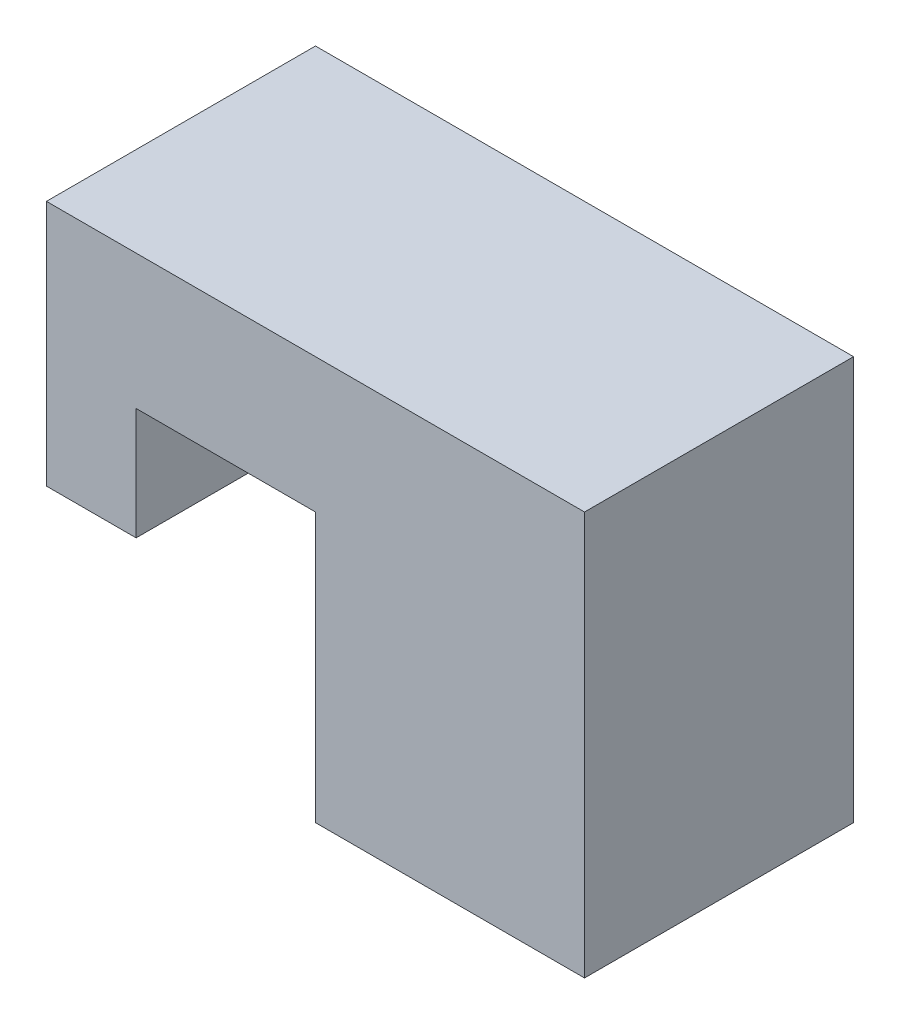
ISO-10303-21;
HEADER;
FILE_DESCRIPTION(('STEP AP214'),'2;1');
FILE_NAME('part.step','',(''),(''),'','','');
FILE_SCHEMA(('AUTOMOTIVE_DESIGN { 1 0 10303 214 1 1 1 1 }'));
ENDSEC;
DATA;
#1=APPLICATION_CONTEXT('core data for automotive mechanical design processes');
#2=APPLICATION_PROTOCOL_DEFINITION('international standard','automotive_design',2000,#1);
#3=PRODUCT_CONTEXT('',#1,'mechanical');
#4=PRODUCT('Part','Part','',(#3));
#5=PRODUCT_RELATED_PRODUCT_CATEGORY('part','',(#4));
#6=PRODUCT_DEFINITION_FORMATION('','',#4);
#7=PRODUCT_DEFINITION_CONTEXT('part definition',#1,'design');
#8=PRODUCT_DEFINITION('design','',#6,#7);
#9=PRODUCT_DEFINITION_SHAPE('','',#8);
#10=(LENGTH_UNIT() NAMED_UNIT(*) SI_UNIT(.MILLI.,.METRE.));
#11=(NAMED_UNIT(*) PLANE_ANGLE_UNIT() SI_UNIT($,.RADIAN.));
#12=(NAMED_UNIT(*) SI_UNIT($,.STERADIAN.) SOLID_ANGLE_UNIT());
#13=UNCERTAINTY_MEASURE_WITH_UNIT(LENGTH_MEASURE(1.E-05),#10,'distance_accuracy_value','');
#14=(GEOMETRIC_REPRESENTATION_CONTEXT(3) GLOBAL_UNCERTAINTY_ASSIGNED_CONTEXT((#13)) GLOBAL_UNIT_ASSIGNED_CONTEXT((#10,
#11,#12)) REPRESENTATION_CONTEXT('',''));
#15=CARTESIAN_POINT('',(0.,0.,0.));
#16=DIRECTION('',(0.,0.,1.));
#17=DIRECTION('',(1.,0.,0.));
#18=AXIS2_PLACEMENT_3D('',#15,#16,#17);
#19=CARTESIAN_POINT('',(0.,6.,0.));
#20=DIRECTION('',(0.,1.,0.));
#21=DIRECTION('',(0.,0.,1.));
#22=AXIS2_PLACEMENT_3D('',#19,#20,#21);
#23=PLANE('',#22);
#24=DIRECTION('',(0.,0.,1.));
#25=VECTOR('',#24,1.);
#26=CARTESIAN_POINT('',(-7.,6.,3.));
#27=LINE('',#26,#25);
#28=CARTESIAN_POINT('',(-7.,6.,-3.));
#29=VERTEX_POINT('',#28);
#30=CARTESIAN_POINT('',(-7.,6.,3.));
#31=VERTEX_POINT('',#30);
#32=EDGE_CURVE('E190',#29,#31,#27,.T.);
#33=ORIENTED_EDGE('',*,*,#32,.F.);
#34=DIRECTION('',(-1.,0.,0.));
#35=VECTOR('',#34,1.);
#36=CARTESIAN_POINT('',(3.,6.,-3.));
#37=LINE('',#36,#35);
#38=CARTESIAN_POINT('',(-3.,6.,-3.));
#39=VERTEX_POINT('',#38);
#40=EDGE_CURVE('E137',#39,#29,#37,.T.);
#41=ORIENTED_EDGE('',*,*,#40,.F.);
#42=DIRECTION('',(0.,0.,1.));
#43=VECTOR('',#42,1.);
#44=CARTESIAN_POINT('',(-3.,6.,3.));
#45=LINE('',#44,#43);
#46=CARTESIAN_POINT('',(-3.,6.,3.));
#47=VERTEX_POINT('',#46);
#48=EDGE_CURVE('E98',#39,#47,#45,.T.);
#49=ORIENTED_EDGE('',*,*,#48,.T.);
#50=DIRECTION('',(1.,0.,0.));
#51=VECTOR('',#50,1.);
#52=CARTESIAN_POINT('',(3.,6.,3.));
#53=LINE('',#52,#51);
#54=EDGE_CURVE('E89',#31,#47,#53,.T.);
#55=ORIENTED_EDGE('',*,*,#54,.F.);
#56=EDGE_LOOP('',(#33,#41,#49,#55));
#57=FACE_BOUND('',#56,.T.);
#58=ADVANCED_FACE('F39',(#57),#23,.F.);
#59=CARTESIAN_POINT('',(3.,6.,3.));
#60=DIRECTION('',(-1.,0.,0.));
#61=DIRECTION('',(0.,0.,1.));
#62=AXIS2_PLACEMENT_3D('',#59,#60,#61);
#63=PLANE('',#62);
#64=DIRECTION('',(0.,0.,-1.));
#65=VECTOR('',#64,1.);
#66=CARTESIAN_POINT('',(3.,0.,3.));
#67=LINE('',#66,#65);
#68=CARTESIAN_POINT('',(3.,0.,3.));
#69=VERTEX_POINT('',#68);
#70=CARTESIAN_POINT('',(3.,0.,-3.));
#71=VERTEX_POINT('',#70);
#72=EDGE_CURVE('E96',#69,#71,#67,.T.);
#73=ORIENTED_EDGE('',*,*,#72,.T.);
#74=DIRECTION('',(0.,-1.,0.));
#75=VECTOR('',#74,1.);
#76=CARTESIAN_POINT('',(3.,6.,-3.));
#77=LINE('',#76,#75);
#78=CARTESIAN_POINT('',(3.,9.,-3.));
#79=VERTEX_POINT('',#78);
#80=EDGE_CURVE('E11',#79,#71,#77,.T.);
#81=ORIENTED_EDGE('',*,*,#80,.F.);
#82=DIRECTION('',(0.,0.,-1.));
#83=VECTOR('',#82,1.);
#84=CARTESIAN_POINT('',(3.,9.,-3.));
#85=LINE('',#84,#83);
#86=CARTESIAN_POINT('',(3.,9.,3.));
#87=VERTEX_POINT('',#86);
#88=EDGE_CURVE('E111',#87,#79,#85,.T.);
#89=ORIENTED_EDGE('',*,*,#88,.F.);
#90=DIRECTION('',(0.,-1.,0.));
#91=VECTOR('',#90,1.);
#92=CARTESIAN_POINT('',(3.,6.,3.));
#93=LINE('',#92,#91);
#94=EDGE_CURVE('E91',#87,#69,#93,.T.);
#95=ORIENTED_EDGE('',*,*,#94,.T.);
#96=EDGE_LOOP('',(#73,#81,#89,#95));
#97=FACE_BOUND('',#96,.T.);
#98=ADVANCED_FACE('F41',(#97),#63,.F.);
#99=CARTESIAN_POINT('',(-3.,6.,-3.));
#100=DIRECTION('',(0.,0.,1.));
#101=DIRECTION('',(1.,0.,0.));
#102=AXIS2_PLACEMENT_3D('',#99,#100,#101);
#103=PLANE('',#102);
#104=DIRECTION('',(-1.,0.,0.));
#105=VECTOR('',#104,1.);
#106=CARTESIAN_POINT('',(-3.,0.,-3.));
#107=LINE('',#106,#105);
#108=CARTESIAN_POINT('',(-3.,0.,-3.));
#109=VERTEX_POINT('',#108);
#110=EDGE_CURVE('E80',#71,#109,#107,.T.);
#111=ORIENTED_EDGE('',*,*,#110,.T.);
#112=DIRECTION('',(0.,-1.,0.));
#113=VECTOR('',#112,1.);
#114=CARTESIAN_POINT('',(-3.,6.,-3.));
#115=LINE('',#114,#113);
#116=EDGE_CURVE('E49',#39,#109,#115,.T.);
#117=ORIENTED_EDGE('',*,*,#116,.F.);
#118=ORIENTED_EDGE('',*,*,#40,.T.);
#119=DIRECTION('',(0.,1.,0.));
#120=VECTOR('',#119,1.);
#121=CARTESIAN_POINT('',(-7.,3.5,-3.));
#122=LINE('',#121,#120);
#123=CARTESIAN_POINT('',(-7.,3.5,-3.));
#124=VERTEX_POINT('',#123);
#125=EDGE_CURVE('E140',#124,#29,#122,.T.);
#126=ORIENTED_EDGE('',*,*,#125,.F.);
#127=DIRECTION('',(1.,0.,0.));
#128=VECTOR('',#127,1.);
#129=CARTESIAN_POINT('',(-9.,3.5,-3.));
#130=LINE('',#129,#128);
#131=CARTESIAN_POINT('',(-9.,3.5,-3.));
#132=VERTEX_POINT('',#131);
#133=EDGE_CURVE('E183',#132,#124,#130,.T.);
#134=ORIENTED_EDGE('',*,*,#133,.F.);
#135=DIRECTION('',(0.,-1.,0.));
#136=VECTOR('',#135,1.);
#137=CARTESIAN_POINT('',(-9.,9.,-3.));
#138=LINE('',#137,#136);
#139=CARTESIAN_POINT('',(-9.,9.,-3.));
#140=VERTEX_POINT('',#139);
#141=EDGE_CURVE('E145',#140,#132,#138,.T.);
#142=ORIENTED_EDGE('',*,*,#141,.F.);
#143=DIRECTION('',(-1.,0.,0.));
#144=VECTOR('',#143,1.);
#145=CARTESIAN_POINT('',(3.,9.,-3.));
#146=LINE('',#145,#144);
#147=EDGE_CURVE('E133',#79,#140,#146,.T.);
#148=ORIENTED_EDGE('',*,*,#147,.F.);
#149=ORIENTED_EDGE('',*,*,#80,.T.);
#150=EDGE_LOOP('',(#111,#117,#118,#126,#134,#142,#148,#149));
#151=FACE_BOUND('',#150,.T.);
#152=ADVANCED_FACE('F151',(#151),#103,.F.);
#153=CARTESIAN_POINT('',(-3.,6.,3.));
#154=DIRECTION('',(1.,0.,0.));
#155=DIRECTION('',(0.,0.,-1.));
#156=AXIS2_PLACEMENT_3D('',#153,#154,#155);
#157=PLANE('',#156);
#158=DIRECTION('',(0.,0.,1.));
#159=VECTOR('',#158,1.);
#160=CARTESIAN_POINT('',(-3.,0.,3.));
#161=LINE('',#160,#159);
#162=CARTESIAN_POINT('',(-3.,0.,3.));
#163=VERTEX_POINT('',#162);
#164=EDGE_CURVE('E71',#109,#163,#161,.T.);
#165=ORIENTED_EDGE('',*,*,#164,.T.);
#166=DIRECTION('',(0.,-1.,0.));
#167=VECTOR('',#166,1.);
#168=CARTESIAN_POINT('',(-3.,6.,3.));
#169=LINE('',#168,#167);
#170=EDGE_CURVE('E74',#47,#163,#169,.T.);
#171=ORIENTED_EDGE('',*,*,#170,.F.);
#172=ORIENTED_EDGE('',*,*,#48,.F.);
#173=ORIENTED_EDGE('',*,*,#116,.T.);
#174=EDGE_LOOP('',(#165,#171,#172,#173));
#175=FACE_BOUND('',#174,.T.);
#176=ADVANCED_FACE('F73',(#175),#157,.F.);
#177=CARTESIAN_POINT('',(-3.,6.,3.));
#178=DIRECTION('',(0.,0.,-1.));
#179=DIRECTION('',(-1.,0.,0.));
#180=AXIS2_PLACEMENT_3D('',#177,#178,#179);
#181=PLANE('',#180);
#182=DIRECTION('',(1.,0.,0.));
#183=VECTOR('',#182,1.);
#184=CARTESIAN_POINT('',(-3.,0.,3.));
#185=LINE('',#184,#183);
#186=EDGE_CURVE('E79',#163,#69,#185,.T.);
#187=ORIENTED_EDGE('',*,*,#186,.T.);
#188=ORIENTED_EDGE('',*,*,#94,.F.);
#189=DIRECTION('',(1.,0.,0.));
#190=VECTOR('',#189,1.);
#191=CARTESIAN_POINT('',(3.,9.,3.));
#192=LINE('',#191,#190);
#193=CARTESIAN_POINT('',(-9.,9.,3.));
#194=VERTEX_POINT('',#193);
#195=EDGE_CURVE('E116',#194,#87,#192,.T.);
#196=ORIENTED_EDGE('',*,*,#195,.F.);
#197=DIRECTION('',(0.,-1.,0.));
#198=VECTOR('',#197,1.);
#199=CARTESIAN_POINT('',(-9.,9.,3.));
#200=LINE('',#199,#198);
#201=CARTESIAN_POINT('',(-9.,3.5,3.));
#202=VERTEX_POINT('',#201);
#203=EDGE_CURVE('E131',#194,#202,#200,.T.);
#204=ORIENTED_EDGE('',*,*,#203,.T.);
#205=DIRECTION('',(-1.,0.,0.));
#206=VECTOR('',#205,1.);
#207=CARTESIAN_POINT('',(-9.,3.5,3.));
#208=LINE('',#207,#206);
#209=CARTESIAN_POINT('',(-7.,3.5,3.));
#210=VERTEX_POINT('',#209);
#211=EDGE_CURVE('E175',#210,#202,#208,.T.);
#212=ORIENTED_EDGE('',*,*,#211,.F.);
#213=DIRECTION('',(0.,1.,0.));
#214=VECTOR('',#213,1.);
#215=CARTESIAN_POINT('',(-7.,3.5,3.));
#216=LINE('',#215,#214);
#217=EDGE_CURVE('E198',#210,#31,#216,.T.);
#218=ORIENTED_EDGE('',*,*,#217,.T.);
#219=ORIENTED_EDGE('',*,*,#54,.T.);
#220=ORIENTED_EDGE('',*,*,#170,.T.);
#221=EDGE_LOOP('',(#187,#188,#196,#204,#212,#218,#219,#220));
#222=FACE_BOUND('',#221,.T.);
#223=ADVANCED_FACE('F84',(#222),#181,.F.);
#224=CARTESIAN_POINT('',(0.,0.,0.));
#225=DIRECTION('',(0.,-1.,0.));
#226=DIRECTION('',(0.,0.,-1.));
#227=AXIS2_PLACEMENT_3D('',#224,#225,#226);
#228=PLANE('',#227);
#229=ORIENTED_EDGE('',*,*,#72,.F.);
#230=ORIENTED_EDGE('',*,*,#186,.F.);
#231=ORIENTED_EDGE('',*,*,#164,.F.);
#232=ORIENTED_EDGE('',*,*,#110,.F.);
#233=EDGE_LOOP('',(#229,#230,#231,#232));
#234=FACE_BOUND('',#233,.T.);
#235=ADVANCED_FACE('F94',(#234),#228,.T.);
#236=CARTESIAN_POINT('',(-9.,9.,-3.));
#237=DIRECTION('',(1.,0.,0.));
#238=DIRECTION('',(0.,0.,-1.));
#239=AXIS2_PLACEMENT_3D('',#236,#237,#238);
#240=PLANE('',#239);
#241=ORIENTED_EDGE('',*,*,#141,.T.);
#242=DIRECTION('',(0.,0.,-1.));
#243=VECTOR('',#242,1.);
#244=CARTESIAN_POINT('',(-9.,3.5,3.));
#245=LINE('',#244,#243);
#246=EDGE_CURVE('E178',#202,#132,#245,.T.);
#247=ORIENTED_EDGE('',*,*,#246,.F.);
#248=ORIENTED_EDGE('',*,*,#203,.F.);
#249=DIRECTION('',(0.,0.,1.));
#250=VECTOR('',#249,1.);
#251=CARTESIAN_POINT('',(-9.,9.,-3.));
#252=LINE('',#251,#250);
#253=EDGE_CURVE('E125',#140,#194,#252,.T.);
#254=ORIENTED_EDGE('',*,*,#253,.F.);
#255=EDGE_LOOP('',(#241,#247,#248,#254));
#256=FACE_BOUND('',#255,.T.);
#257=ADVANCED_FACE('F179',(#256),#240,.F.);
#258=CARTESIAN_POINT('',(0.,9.,0.));
#259=DIRECTION('',(0.,1.,0.));
#260=DIRECTION('',(0.,0.,1.));
#261=AXIS2_PLACEMENT_3D('',#258,#259,#260);
#262=PLANE('',#261);
#263=ORIENTED_EDGE('',*,*,#147,.T.);
#264=ORIENTED_EDGE('',*,*,#253,.T.);
#265=ORIENTED_EDGE('',*,*,#195,.T.);
#266=ORIENTED_EDGE('',*,*,#88,.T.);
#267=EDGE_LOOP('',(#263,#264,#265,#266));
#268=FACE_BOUND('',#267,.T.);
#269=ADVANCED_FACE('F122',(#268),#262,.T.);
#270=CARTESIAN_POINT('',(-7.,3.5,3.));
#271=DIRECTION('',(-1.,0.,0.));
#272=DIRECTION('',(0.,0.,1.));
#273=AXIS2_PLACEMENT_3D('',#270,#271,#272);
#274=PLANE('',#273);
#275=ORIENTED_EDGE('',*,*,#32,.T.);
#276=ORIENTED_EDGE('',*,*,#217,.F.);
#277=DIRECTION('',(0.,0.,1.));
#278=VECTOR('',#277,1.);
#279=CARTESIAN_POINT('',(-7.,3.5,3.));
#280=LINE('',#279,#278);
#281=EDGE_CURVE('E187',#124,#210,#280,.T.);
#282=ORIENTED_EDGE('',*,*,#281,.F.);
#283=ORIENTED_EDGE('',*,*,#125,.T.);
#284=EDGE_LOOP('',(#275,#276,#282,#283));
#285=FACE_BOUND('',#284,.T.);
#286=ADVANCED_FACE('F208',(#285),#274,.F.);
#287=CARTESIAN_POINT('',(0.,3.5,0.));
#288=DIRECTION('',(0.,1.,0.));
#289=DIRECTION('',(0.,0.,1.));
#290=AXIS2_PLACEMENT_3D('',#287,#288,#289);
#291=PLANE('',#290);
#292=ORIENTED_EDGE('',*,*,#211,.T.);
#293=ORIENTED_EDGE('',*,*,#246,.T.);
#294=ORIENTED_EDGE('',*,*,#133,.T.);
#295=ORIENTED_EDGE('',*,*,#281,.T.);
#296=EDGE_LOOP('',(#292,#293,#294,#295));
#297=FACE_BOUND('',#296,.T.);
#298=ADVANCED_FACE('F185',(#297),#291,.F.);
#299=CLOSED_SHELL('',(#58,#98,#152,#176,#223,#235,#257,#269,#286,#298));
#300=MANIFOLD_SOLID_BREP('B2',#299);
#301=ADVANCED_BREP_SHAPE_REPRESENTATION('',(#18,#300),#14);
#302=SHAPE_DEFINITION_REPRESENTATION(#9,#301);
ENDSEC;
END-ISO-10303-21;
